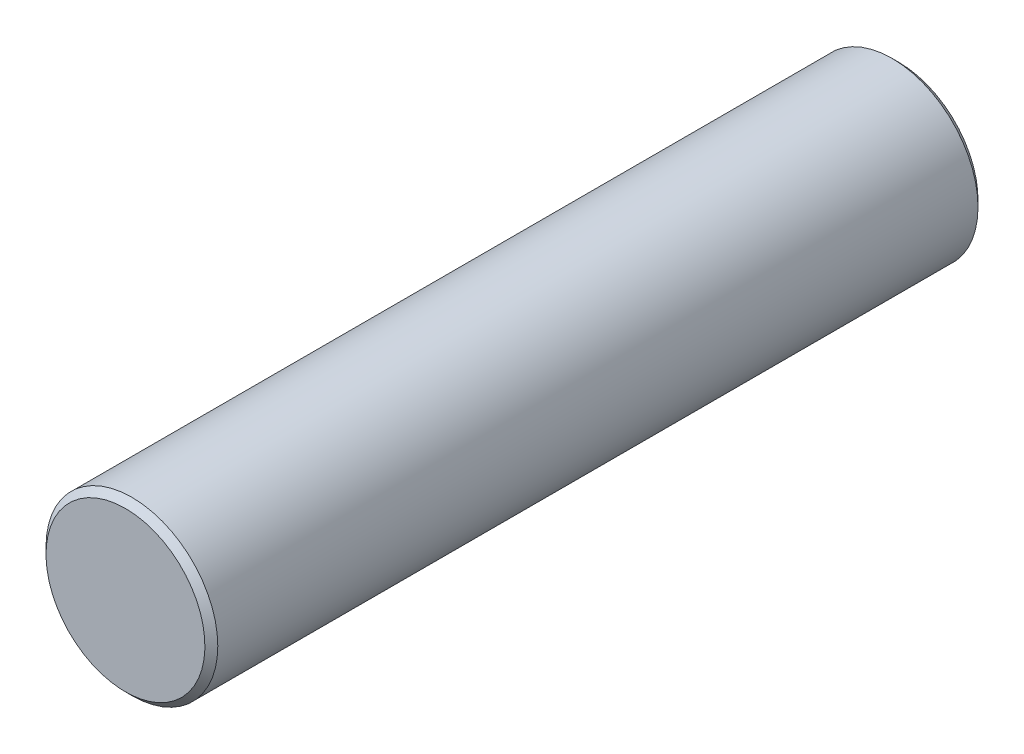
ISO-10303-21;
HEADER;
FILE_DESCRIPTION(('STEP AP214'),'2;1');
FILE_NAME('part.step','',(''),(''),'','','');
FILE_SCHEMA(('AUTOMOTIVE_DESIGN { 1 0 10303 214 1 1 1 1 }'));
ENDSEC;
DATA;
#1=APPLICATION_CONTEXT('core data for automotive mechanical design processes');
#2=APPLICATION_PROTOCOL_DEFINITION('international standard','automotive_design',2000,#1);
#3=PRODUCT_CONTEXT('',#1,'mechanical');
#4=PRODUCT('Part','Part','',(#3));
#5=PRODUCT_RELATED_PRODUCT_CATEGORY('part','',(#4));
#6=PRODUCT_DEFINITION_FORMATION('','',#4);
#7=PRODUCT_DEFINITION_CONTEXT('part definition',#1,'design');
#8=PRODUCT_DEFINITION('design','',#6,#7);
#9=PRODUCT_DEFINITION_SHAPE('','',#8);
#10=(LENGTH_UNIT() NAMED_UNIT(*) SI_UNIT(.MILLI.,.METRE.));
#11=(NAMED_UNIT(*) PLANE_ANGLE_UNIT() SI_UNIT($,.RADIAN.));
#12=(NAMED_UNIT(*) SI_UNIT($,.STERADIAN.) SOLID_ANGLE_UNIT());
#13=UNCERTAINTY_MEASURE_WITH_UNIT(LENGTH_MEASURE(1.E-05),#10,'distance_accuracy_value','');
#14=(GEOMETRIC_REPRESENTATION_CONTEXT(3) GLOBAL_UNCERTAINTY_ASSIGNED_CONTEXT((#13)) GLOBAL_UNIT_ASSIGNED_CONTEXT((#10,
#11,#12)) REPRESENTATION_CONTEXT('',''));
#15=CARTESIAN_POINT('',(0.,0.,0.));
#16=DIRECTION('',(0.,0.,1.));
#17=DIRECTION('',(1.,0.,0.));
#18=AXIS2_PLACEMENT_3D('',#15,#16,#17);
#19=CARTESIAN_POINT('',(0.,9.25,0.));
#20=DIRECTION('',(0.,0.,-1.));
#21=DIRECTION('',(0.,1.,0.));
#22=AXIS2_PLACEMENT_3D('',#19,#20,#21);
#23=PLANE('',#22);
#24=CARTESIAN_POINT('',(0.,0.,0.));
#25=DIRECTION('',(0.,0.,-1.));
#26=DIRECTION('',(0.,1.,0.));
#27=AXIS2_PLACEMENT_3D('',#24,#25,#26);
#28=CIRCLE('',#27,18.5);
#29=CARTESIAN_POINT('',(0.,18.5,0.));
#30=VERTEX_POINT('',#29);
#31=EDGE_CURVE('E9',#30,#30,#28,.T.);
#32=ORIENTED_EDGE('',*,*,#31,.T.);
#33=EDGE_LOOP('',(#32));
#34=FACE_BOUND('',#33,.T.);
#35=CARTESIAN_POINT('',(0.,0.,0.));
#36=DIRECTION('',(0.,0.,1.));
#37=DIRECTION('',(-1.,0.,0.));
#38=AXIS2_PLACEMENT_3D('',#35,#36,#37);
#39=CIRCLE('',#38,6.);
#40=CARTESIAN_POINT('',(-6.,0.,0.));
#41=VERTEX_POINT('',#40);
#42=EDGE_CURVE('E66',#41,#41,#39,.T.);
#43=ORIENTED_EDGE('',*,*,#42,.T.);
#44=EDGE_LOOP('',(#43));
#45=FACE_BOUND('',#44,.T.);
#46=ADVANCED_FACE('F15',(#34,#45),#23,.T.);
#47=CARTESIAN_POINT('',(0.,0.,0.75));
#48=DIRECTION('',(0.,0.,1.));
#49=DIRECTION('',(0.,1.,0.));
#50=AXIS2_PLACEMENT_3D('',#47,#48,#49);
#51=CONICAL_SURFACE('',#50,19.25,0.785398163397448);
#52=CARTESIAN_POINT('',(0.,0.,1.5));
#53=DIRECTION('',(0.,0.,-1.));
#54=DIRECTION('',(0.,1.,0.));
#55=AXIS2_PLACEMENT_3D('',#52,#53,#54);
#56=CIRCLE('',#55,20.);
#57=CARTESIAN_POINT('',(0.,20.,1.5));
#58=VERTEX_POINT('',#57);
#59=EDGE_CURVE('E25',#58,#58,#56,.T.);
#60=ORIENTED_EDGE('',*,*,#59,.T.);
#61=EDGE_LOOP('',(#60));
#62=FACE_BOUND('',#61,.T.);
#63=ORIENTED_EDGE('',*,*,#31,.F.);
#64=EDGE_LOOP('',(#63));
#65=FACE_BOUND('',#64,.T.);
#66=ADVANCED_FACE('F113',(#62,#65),#51,.T.);
#67=CARTESIAN_POINT('',(0.,0.,90.));
#68=DIRECTION('',(0.,0.,1.));
#69=DIRECTION('',(0.,1.,0.));
#70=AXIS2_PLACEMENT_3D('',#67,#68,#69);
#71=CYLINDRICAL_SURFACE('',#70,20.);
#72=CARTESIAN_POINT('',(0.,0.,178.5));
#73=DIRECTION('',(0.,0.,-1.));
#74=DIRECTION('',(0.,1.,0.));
#75=AXIS2_PLACEMENT_3D('',#72,#73,#74);
#76=CIRCLE('',#75,20.);
#77=CARTESIAN_POINT('',(0.,20.,178.5));
#78=VERTEX_POINT('',#77);
#79=EDGE_CURVE('E68',#78,#78,#76,.T.);
#80=ORIENTED_EDGE('',*,*,#79,.T.);
#81=EDGE_LOOP('',(#80));
#82=FACE_BOUND('',#81,.T.);
#83=ORIENTED_EDGE('',*,*,#59,.F.);
#84=EDGE_LOOP('',(#83));
#85=FACE_BOUND('',#84,.T.);
#86=CARTESIAN_POINT('',(0.,0.,6.5));
#87=DIRECTION('',(0.,0.,-1.));
#88=DIRECTION('',(0.,1.,0.));
#89=AXIS2_PLACEMENT_3D('',#86,#87,#88);
#90=CIRCLE('',#89,20.);
#91=CARTESIAN_POINT('',(10.5356537528527,-17.,6.5));
#92=VERTEX_POINT('',#91);
#93=CARTESIAN_POINT('',(-10.5356537528527,-17.,6.5));
#94=VERTEX_POINT('',#93);
#95=EDGE_CURVE('E87',#92,#94,#90,.T.);
#96=ORIENTED_EDGE('',*,*,#95,.T.);
#97=DIRECTION('',(0.,0.,1.));
#98=VECTOR('',#97,1.);
#99=CARTESIAN_POINT('',(-10.5356537528527,-17.,8.25));
#100=LINE('',#99,#98);
#101=CARTESIAN_POINT('',(-10.5356537528527,-17.,10.));
#102=VERTEX_POINT('',#101);
#103=EDGE_CURVE('E84',#94,#102,#100,.T.);
#104=ORIENTED_EDGE('',*,*,#103,.T.);
#105=CARTESIAN_POINT('',(0.,0.,10.));
#106=DIRECTION('',(0.,0.,1.));
#107=DIRECTION('',(0.,1.,0.));
#108=AXIS2_PLACEMENT_3D('',#105,#106,#107);
#109=CIRCLE('',#108,20.);
#110=CARTESIAN_POINT('',(10.5356537528527,-17.,10.));
#111=VERTEX_POINT('',#110);
#112=EDGE_CURVE('E74',#102,#111,#109,.T.);
#113=ORIENTED_EDGE('',*,*,#112,.T.);
#114=DIRECTION('',(0.,0.,-1.));
#115=VECTOR('',#114,1.);
#116=CARTESIAN_POINT('',(10.5356537528527,-17.,8.25));
#117=LINE('',#116,#115);
#118=EDGE_CURVE('E19',#111,#92,#117,.T.);
#119=ORIENTED_EDGE('',*,*,#118,.T.);
#120=EDGE_LOOP('',(#96,#104,#113,#119));
#121=FACE_BOUND('',#120,.T.);
#122=ADVANCED_FACE('F97',(#82,#85,#121),#71,.T.);
#123=CARTESIAN_POINT('',(0.,0.,179.25));
#124=DIRECTION('',(0.,0.,-1.));
#125=DIRECTION('',(0.,1.,0.));
#126=AXIS2_PLACEMENT_3D('',#123,#124,#125);
#127=CONICAL_SURFACE('',#126,19.25,0.785398163397448);
#128=CARTESIAN_POINT('',(0.,0.,180.));
#129=DIRECTION('',(0.,0.,-1.));
#130=DIRECTION('',(0.,1.,0.));
#131=AXIS2_PLACEMENT_3D('',#128,#129,#130);
#132=CIRCLE('',#131,18.5);
#133=CARTESIAN_POINT('',(0.,18.5,180.));
#134=VERTEX_POINT('',#133);
#135=EDGE_CURVE('E60',#134,#134,#132,.T.);
#136=ORIENTED_EDGE('',*,*,#135,.T.);
#137=EDGE_LOOP('',(#136));
#138=FACE_BOUND('',#137,.T.);
#139=ORIENTED_EDGE('',*,*,#79,.F.);
#140=EDGE_LOOP('',(#139));
#141=FACE_BOUND('',#140,.T.);
#142=ADVANCED_FACE('F153',(#138,#141),#127,.T.);
#143=CARTESIAN_POINT('',(0.,9.25,180.));
#144=DIRECTION('',(0.,0.,1.));
#145=DIRECTION('',(0.,-1.,0.));
#146=AXIS2_PLACEMENT_3D('',#143,#144,#145);
#147=PLANE('',#146);
#148=ORIENTED_EDGE('',*,*,#135,.F.);
#149=EDGE_LOOP('',(#148));
#150=FACE_BOUND('',#149,.T.);
#151=ADVANCED_FACE('F126',(#150),#147,.T.);
#152=CARTESIAN_POINT('',(0.,0.,26.4586213285198));
#153=DIRECTION('',(0.,0.,-1.));
#154=DIRECTION('',(-1.,0.,0.));
#155=AXIS2_PLACEMENT_3D('',#152,#153,#154);
#156=CONICAL_SURFACE('',#155,2.52640625,1.0471975511966);
#157=CARTESIAN_POINT('',(0.,0.,25.));
#158=DIRECTION('',(0.,0.,1.));
#159=DIRECTION('',(-1.,0.,0.));
#160=AXIS2_PLACEMENT_3D('',#157,#158,#159);
#161=CIRCLE('',#160,5.0528125);
#162=CARTESIAN_POINT('',(-5.0528125,0.,25.));
#163=VERTEX_POINT('',#162);
#164=EDGE_CURVE('E64',#163,#163,#161,.T.);
#165=ORIENTED_EDGE('',*,*,#164,.F.);
#166=EDGE_LOOP('',(#165));
#167=FACE_BOUND('',#166,.T.);
#168=CARTESIAN_POINT('',(0.,0.,27.9172426570397));
#169=VERTEX_POINT('',#168);
#170=VERTEX_LOOP('',#169);
#171=FACE_BOUND('',#170,.T.);
#172=ADVANCED_FACE('F124',(#167,#171),#156,.F.);
#173=CARTESIAN_POINT('',(0.,0.,12.97359375));
#174=DIRECTION('',(0.,0.,-1.));
#175=DIRECTION('',(-1.,0.,0.));
#176=AXIS2_PLACEMENT_3D('',#173,#174,#175);
#177=CYLINDRICAL_SURFACE('',#176,5.0528125);
#178=CARTESIAN_POINT('',(0.,0.,0.9471875));
#179=DIRECTION('',(0.,0.,1.));
#180=DIRECTION('',(-1.,0.,0.));
#181=AXIS2_PLACEMENT_3D('',#178,#179,#180);
#182=CIRCLE('',#181,5.0528125);
#183=CARTESIAN_POINT('',(-5.0528125,0.,0.9471875));
#184=VERTEX_POINT('',#183);
#185=EDGE_CURVE('E70',#184,#184,#182,.T.);
#186=ORIENTED_EDGE('',*,*,#185,.F.);
#187=EDGE_LOOP('',(#186));
#188=FACE_BOUND('',#187,.T.);
#189=ORIENTED_EDGE('',*,*,#164,.T.);
#190=EDGE_LOOP('',(#189));
#191=FACE_BOUND('',#190,.T.);
#192=ADVANCED_FACE('F17',(#188,#191),#177,.F.);
#193=CARTESIAN_POINT('',(0.,0.,0.47359375));
#194=DIRECTION('',(0.,0.,-1.));
#195=DIRECTION('',(-1.,0.,0.));
#196=AXIS2_PLACEMENT_3D('',#193,#194,#195);
#197=CONICAL_SURFACE('',#196,5.52640625,0.785398163397448);
#198=ORIENTED_EDGE('',*,*,#42,.F.);
#199=EDGE_LOOP('',(#198));
#200=FACE_BOUND('',#199,.T.);
#201=ORIENTED_EDGE('',*,*,#185,.T.);
#202=EDGE_LOOP('',(#201));
#203=FACE_BOUND('',#202,.T.);
#204=ADVANCED_FACE('F122',(#200,#203),#197,.F.);
#205=CARTESIAN_POINT('',(0.,-17.,8.25));
#206=DIRECTION('',(0.,-1.,0.));
#207=DIRECTION('',(0.,0.,-1.));
#208=AXIS2_PLACEMENT_3D('',#205,#206,#207);
#209=PLANE('',#208);
#210=ORIENTED_EDGE('',*,*,#103,.F.);
#211=DIRECTION('',(1.,0.,0.));
#212=VECTOR('',#211,1.);
#213=CARTESIAN_POINT('',(0.,-17.,6.5));
#214=LINE('',#213,#212);
#215=EDGE_CURVE('E90',#94,#92,#214,.T.);
#216=ORIENTED_EDGE('',*,*,#215,.T.);
#217=ORIENTED_EDGE('',*,*,#118,.F.);
#218=DIRECTION('',(-1.,0.,0.));
#219=VECTOR('',#218,1.);
#220=CARTESIAN_POINT('',(0.,-17.,10.));
#221=LINE('',#220,#219);
#222=EDGE_CURVE('E76',#111,#102,#221,.T.);
#223=ORIENTED_EDGE('',*,*,#222,.T.);
#224=EDGE_LOOP('',(#210,#216,#217,#223));
#225=FACE_BOUND('',#224,.T.);
#226=ADVANCED_FACE('F100',(#225),#209,.T.);
#227=CARTESIAN_POINT('',(0.,-19.5,6.5));
#228=DIRECTION('',(0.,0.,1.));
#229=DIRECTION('',(1.,0.,0.));
#230=AXIS2_PLACEMENT_3D('',#227,#228,#229);
#231=PLANE('',#230);
#232=ORIENTED_EDGE('',*,*,#95,.F.);
#233=ORIENTED_EDGE('',*,*,#215,.F.);
#234=EDGE_LOOP('',(#232,#233));
#235=FACE_BOUND('',#234,.T.);
#236=ADVANCED_FACE('F104',(#235),#231,.T.);
#237=CARTESIAN_POINT('',(0.,-19.5,10.));
#238=DIRECTION('',(0.,0.,1.));
#239=DIRECTION('',(1.,0.,0.));
#240=AXIS2_PLACEMENT_3D('',#237,#238,#239);
#241=PLANE('',#240);
#242=ORIENTED_EDGE('',*,*,#112,.F.);
#243=ORIENTED_EDGE('',*,*,#222,.F.);
#244=EDGE_LOOP('',(#242,#243));
#245=FACE_BOUND('',#244,.T.);
#246=ADVANCED_FACE('F102',(#245),#241,.F.);
#247=CLOSED_SHELL('',(#46,#66,#122,#142,#151,#172,#192,#204,#226,#236,#246));
#248=MANIFOLD_SOLID_BREP('B1',#247);
#249=ADVANCED_BREP_SHAPE_REPRESENTATION('',(#18,#248),#14);
#250=SHAPE_DEFINITION_REPRESENTATION(#9,#249);
ENDSEC;
END-ISO-10303-21;
